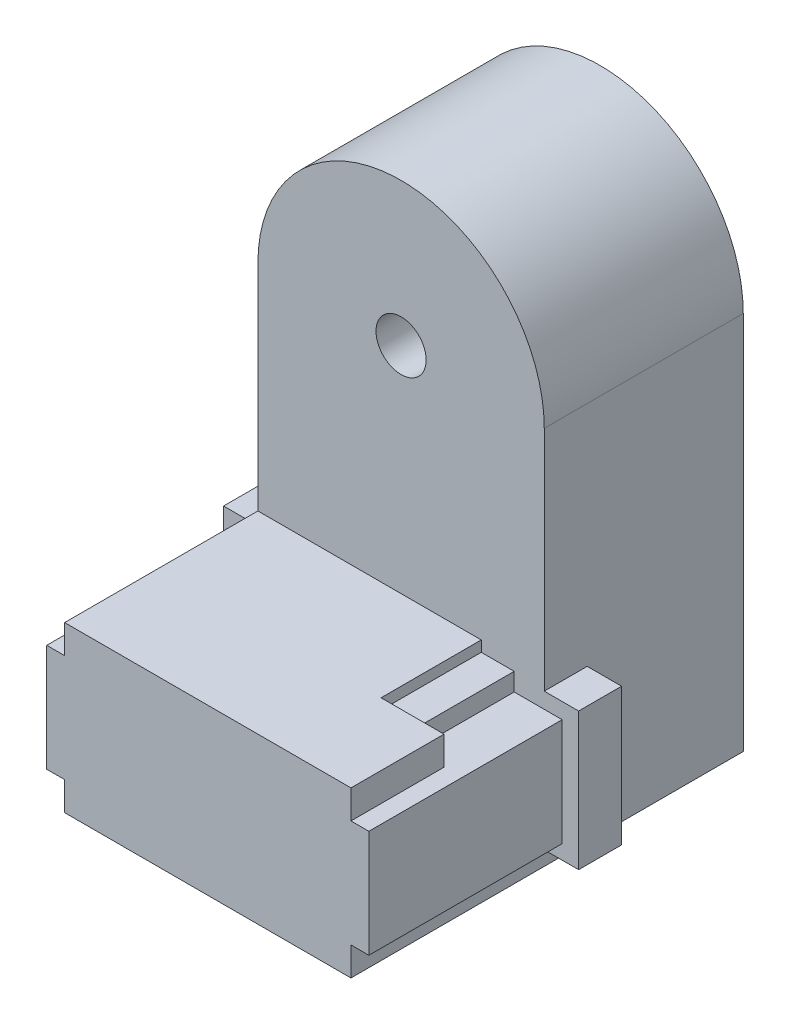
ISO-10303-21;
HEADER;
FILE_DESCRIPTION(('STEP AP214'),'2;1');
FILE_NAME('part.step','',(''),(''),'','','');
FILE_SCHEMA(('AUTOMOTIVE_DESIGN { 1 0 10303 214 1 1 1 1 }'));
ENDSEC;
DATA;
#1=APPLICATION_CONTEXT('core data for automotive mechanical design processes');
#2=APPLICATION_PROTOCOL_DEFINITION('international standard','automotive_design',2000,#1);
#3=PRODUCT_CONTEXT('',#1,'mechanical');
#4=PRODUCT('Part','Part','',(#3));
#5=PRODUCT_RELATED_PRODUCT_CATEGORY('part','',(#4));
#6=PRODUCT_DEFINITION_FORMATION('','',#4);
#7=PRODUCT_DEFINITION_CONTEXT('part definition',#1,'design');
#8=PRODUCT_DEFINITION('design','',#6,#7);
#9=PRODUCT_DEFINITION_SHAPE('','',#8);
#10=(LENGTH_UNIT() NAMED_UNIT(*) SI_UNIT(.MILLI.,.METRE.));
#11=(NAMED_UNIT(*) PLANE_ANGLE_UNIT() SI_UNIT($,.RADIAN.));
#12=(NAMED_UNIT(*) SI_UNIT($,.STERADIAN.) SOLID_ANGLE_UNIT());
#13=UNCERTAINTY_MEASURE_WITH_UNIT(LENGTH_MEASURE(1.E-05),#10,'distance_accuracy_value','');
#14=(GEOMETRIC_REPRESENTATION_CONTEXT(3) GLOBAL_UNCERTAINTY_ASSIGNED_CONTEXT((#13)) GLOBAL_UNIT_ASSIGNED_CONTEXT((#10,
#11,#12)) REPRESENTATION_CONTEXT('',''));
#15=CARTESIAN_POINT('',(0.,0.,0.));
#16=DIRECTION('',(0.,0.,1.));
#17=DIRECTION('',(1.,0.,0.));
#18=AXIS2_PLACEMENT_3D('',#15,#16,#17);
#19=CARTESIAN_POINT('',(20.,0.,13.9));
#20=DIRECTION('',(-1.,0.,0.));
#21=DIRECTION('',(0.,0.,1.));
#22=AXIS2_PLACEMENT_3D('',#19,#20,#21);
#23=PLANE('',#22);
#24=DIRECTION('',(0.,1.,0.));
#25=VECTOR('',#24,1.);
#26=CARTESIAN_POINT('',(20.,11.5,20.9));
#27=LINE('',#26,#25);
#28=CARTESIAN_POINT('',(20.,9.49999999999999,20.9));
#29=VERTEX_POINT('',#28);
#30=CARTESIAN_POINT('',(20.,11.5,20.9));
#31=VERTEX_POINT('',#30);
#32=EDGE_CURVE('E55',#29,#31,#27,.T.);
#33=ORIENTED_EDGE('',*,*,#32,.T.);
#34=DIRECTION('',(0.,0.,-1.));
#35=VECTOR('',#34,1.);
#36=CARTESIAN_POINT('',(20.,11.5,27.4));
#37=LINE('',#36,#35);
#38=CARTESIAN_POINT('',(20.,11.5,27.4));
#39=VERTEX_POINT('',#38);
#40=EDGE_CURVE('E256',#39,#31,#37,.T.);
#41=ORIENTED_EDGE('',*,*,#40,.F.);
#42=DIRECTION('',(0.,1.,0.));
#43=VECTOR('',#42,1.);
#44=CARTESIAN_POINT('',(20.,0.,27.4));
#45=LINE('',#44,#43);
#46=CARTESIAN_POINT('',(20.,9.49999999999999,27.4));
#47=VERTEX_POINT('',#46);
#48=EDGE_CURVE('E409',#47,#39,#45,.T.);
#49=ORIENTED_EDGE('',*,*,#48,.F.);
#50=DIRECTION('',(0.,0.,1.));
#51=VECTOR('',#50,1.);
#52=CARTESIAN_POINT('',(20.,9.49999999999999,-0.00199999999999853));
#53=LINE('',#52,#51);
#54=EDGE_CURVE('E258',#29,#47,#53,.T.);
#55=ORIENTED_EDGE('',*,*,#54,.F.);
#56=EDGE_LOOP('',(#33,#41,#49,#55));
#57=FACE_BOUND('',#56,.T.);
#58=ADVANCED_FACE('F39',(#57),#23,.F.);
#59=CARTESIAN_POINT('',(0.,0.,13.9));
#60=DIRECTION('',(-1.,0.,0.));
#61=DIRECTION('',(0.,0.,1.));
#62=AXIS2_PLACEMENT_3D('',#59,#60,#61);
#63=PLANE('',#62);
#64=DIRECTION('',(0.,0.,-1.));
#65=VECTOR('',#64,1.);
#66=CARTESIAN_POINT('',(0.,0.,13.9));
#67=LINE('',#66,#65);
#68=CARTESIAN_POINT('',(1.6306400674182E-13,-2.41126563160776E-13,13.9));
#69=VERTEX_POINT('',#68);
#70=CARTESIAN_POINT('',(0.,0.,0.));
#71=VERTEX_POINT('',#70);
#72=EDGE_CURVE('E302',#69,#71,#67,.T.);
#73=ORIENTED_EDGE('',*,*,#72,.F.);
#74=DIRECTION('',(0.,-1.,0.));
#75=VECTOR('',#74,1.);
#76=CARTESIAN_POINT('',(1.6306400674182E-13,-2.41126563160776E-13,13.9));
#77=LINE('',#76,#75);
#78=CARTESIAN_POINT('',(1.70169434099423E-13,1.,13.9));
#79=VERTEX_POINT('',#78);
#80=EDGE_CURVE('E595',#79,#69,#77,.T.);
#81=ORIENTED_EDGE('',*,*,#80,.F.);
#82=DIRECTION('',(0.,0.,1.));
#83=VECTOR('',#82,1.);
#84=CARTESIAN_POINT('',(0.,1.,13.9));
#85=LINE('',#84,#83);
#86=CARTESIAN_POINT('',(0.,1.,10.9));
#87=VERTEX_POINT('',#86);
#88=EDGE_CURVE('E317',#87,#79,#85,.T.);
#89=ORIENTED_EDGE('',*,*,#88,.F.);
#90=DIRECTION('',(0.,1.,0.));
#91=VECTOR('',#90,1.);
#92=CARTESIAN_POINT('',(0.,0.,10.9));
#93=LINE('',#92,#91);
#94=CARTESIAN_POINT('',(0.,10.6,10.9));
#95=VERTEX_POINT('',#94);
#96=EDGE_CURVE('E11',#87,#95,#93,.T.);
#97=ORIENTED_EDGE('',*,*,#96,.T.);
#98=DIRECTION('',(0.,0.,-1.));
#99=VECTOR('',#98,1.);
#100=CARTESIAN_POINT('',(0.,10.6,13.9));
#101=LINE('',#100,#99);
#102=CARTESIAN_POINT('',(0.,10.6,13.9));
#103=VERTEX_POINT('',#102);
#104=EDGE_CURVE('E48',#103,#95,#101,.T.);
#105=ORIENTED_EDGE('',*,*,#104,.F.);
#106=DIRECTION('',(0.,1.,0.));
#107=VECTOR('',#106,1.);
#108=CARTESIAN_POINT('',(0.,0.,13.9));
#109=LINE('',#108,#107);
#110=CARTESIAN_POINT('',(0.,9.5,13.9));
#111=VERTEX_POINT('',#110);
#112=EDGE_CURVE('E314',#111,#103,#109,.T.);
#113=ORIENTED_EDGE('',*,*,#112,.F.);
#114=DIRECTION('',(0.,0.,1.));
#115=VECTOR('',#114,1.);
#116=CARTESIAN_POINT('',(0.,9.5,-0.00199999999999853));
#117=LINE('',#116,#115);
#118=CARTESIAN_POINT('',(0.,9.5,27.4));
#119=VERTEX_POINT('',#118);
#120=EDGE_CURVE('E497',#111,#119,#117,.T.);
#121=ORIENTED_EDGE('',*,*,#120,.T.);
#122=DIRECTION('',(0.,-1.,0.));
#123=VECTOR('',#122,1.);
#124=CARTESIAN_POINT('',(0.,0.,27.4));
#125=LINE('',#124,#123);
#126=CARTESIAN_POINT('',(0.,11.5,27.4));
#127=VERTEX_POINT('',#126);
#128=EDGE_CURVE('E400',#127,#119,#125,.T.);
#129=ORIENTED_EDGE('',*,*,#128,.F.);
#130=DIRECTION('',(0.,0.,-1.));
#131=VECTOR('',#130,1.);
#132=CARTESIAN_POINT('',(0.,11.5,27.4));
#133=LINE('',#132,#131);
#134=CARTESIAN_POINT('',(0.,11.5,13.9));
#135=VERTEX_POINT('',#134);
#136=EDGE_CURVE('E267',#127,#135,#133,.T.);
#137=ORIENTED_EDGE('',*,*,#136,.T.);
#138=DIRECTION('',(0.,1.,0.));
#139=VECTOR('',#138,1.);
#140=CARTESIAN_POINT('',(0.,0.,13.9));
#141=LINE('',#140,#139);
#142=CARTESIAN_POINT('',(0.,26.5,13.9));
#143=VERTEX_POINT('',#142);
#144=EDGE_CURVE('E286',#135,#143,#141,.T.);
#145=ORIENTED_EDGE('',*,*,#144,.T.);
#146=DIRECTION('',(0.,0.,-1.));
#147=VECTOR('',#146,1.);
#148=CARTESIAN_POINT('',(0.,26.5,13.9));
#149=LINE('',#148,#147);
#150=CARTESIAN_POINT('',(0.,26.5,0.));
#151=VERTEX_POINT('',#150);
#152=EDGE_CURVE('E307',#143,#151,#149,.T.);
#153=ORIENTED_EDGE('',*,*,#152,.T.);
#154=DIRECTION('',(0.,1.,0.));
#155=VECTOR('',#154,1.);
#156=CARTESIAN_POINT('',(0.,0.,0.));
#157=LINE('',#156,#155);
#158=EDGE_CURVE('E293',#71,#151,#157,.T.);
#159=ORIENTED_EDGE('',*,*,#158,.F.);
#160=EDGE_LOOP('',(#73,#81,#89,#97,#105,#113,#121,#129,#137,#145,#153,#159));
#161=FACE_BOUND('',#160,.T.);
#162=ADVANCED_FACE('F638',(#161),#63,.T.);
#163=CARTESIAN_POINT('',(0.,11.5,27.4));
#164=DIRECTION('',(0.,-1.,0.));
#165=DIRECTION('',(1.,0.,0.));
#166=AXIS2_PLACEMENT_3D('',#163,#164,#165);
#167=PLANE('',#166);
#168=DIRECTION('',(0.,0.,-1.));
#169=VECTOR('',#168,1.);
#170=CARTESIAN_POINT('',(15.6,11.5,20.9));
#171=LINE('',#170,#169);
#172=CARTESIAN_POINT('',(15.6,11.5,20.9));
#173=VERTEX_POINT('',#172);
#174=CARTESIAN_POINT('',(15.6,11.5,13.9));
#175=VERTEX_POINT('',#174);
#176=EDGE_CURVE('E527',#173,#175,#171,.T.);
#177=ORIENTED_EDGE('',*,*,#176,.T.);
#178=DIRECTION('',(-1.,0.,0.));
#179=VECTOR('',#178,1.);
#180=CARTESIAN_POINT('',(0.,11.5,13.9));
#181=LINE('',#180,#179);
#182=EDGE_CURVE('E399',#175,#135,#181,.T.);
#183=ORIENTED_EDGE('',*,*,#182,.T.);
#184=ORIENTED_EDGE('',*,*,#136,.F.);
#185=DIRECTION('',(-1.,0.,0.));
#186=VECTOR('',#185,1.);
#187=CARTESIAN_POINT('',(0.,11.5,27.4));
#188=LINE('',#187,#186);
#189=EDGE_CURVE('E264',#39,#127,#188,.T.);
#190=ORIENTED_EDGE('',*,*,#189,.F.);
#191=ORIENTED_EDGE('',*,*,#40,.T.);
#192=DIRECTION('',(-1.,0.,0.));
#193=VECTOR('',#192,1.);
#194=CARTESIAN_POINT('',(20.,11.5,20.9));
#195=LINE('',#194,#193);
#196=EDGE_CURVE('E243',#31,#173,#195,.T.);
#197=ORIENTED_EDGE('',*,*,#196,.T.);
#198=EDGE_LOOP('',(#177,#183,#184,#190,#191,#197));
#199=FACE_BOUND('',#198,.T.);
#200=ADVANCED_FACE('F262',(#199),#167,.F.);
#201=DIRECTION('',(0.,1.,0.));
#202=VECTOR('',#201,1.);
#203=CARTESIAN_POINT('',(20.,0.,13.9));
#204=LINE('',#203,#202);
#205=CARTESIAN_POINT('',(20.,10.6,13.9));
#206=VERTEX_POINT('',#205);
#207=CARTESIAN_POINT('',(20.,26.5,13.9));
#208=VERTEX_POINT('',#207);
#209=EDGE_CURVE('E278',#206,#208,#204,.T.);
#210=ORIENTED_EDGE('',*,*,#209,.F.);
#211=DIRECTION('',(0.,0.,-1.));
#212=VECTOR('',#211,1.);
#213=CARTESIAN_POINT('',(20.,10.6,13.9));
#214=LINE('',#213,#212);
#215=CARTESIAN_POINT('',(20.,10.6,10.9));
#216=VERTEX_POINT('',#215);
#217=EDGE_CURVE('E395',#206,#216,#214,.T.);
#218=ORIENTED_EDGE('',*,*,#217,.T.);
#219=DIRECTION('',(0.,1.,0.));
#220=VECTOR('',#219,1.);
#221=CARTESIAN_POINT('',(20.,0.,10.9));
#222=LINE('',#221,#220);
#223=CARTESIAN_POINT('',(20.,1.,10.9));
#224=VERTEX_POINT('',#223);
#225=EDGE_CURVE('E388',#224,#216,#222,.T.);
#226=ORIENTED_EDGE('',*,*,#225,.F.);
#227=DIRECTION('',(0.,0.,1.));
#228=VECTOR('',#227,1.);
#229=CARTESIAN_POINT('',(20.,1.,13.9));
#230=LINE('',#229,#228);
#231=CARTESIAN_POINT('',(20.,1.,13.9));
#232=VERTEX_POINT('',#231);
#233=EDGE_CURVE('E391',#224,#232,#230,.T.);
#234=ORIENTED_EDGE('',*,*,#233,.T.);
#235=DIRECTION('',(0.,1.,0.));
#236=VECTOR('',#235,1.);
#237=CARTESIAN_POINT('',(20.,0.,13.9));
#238=LINE('',#237,#236);
#239=CARTESIAN_POINT('',(20.,1.99999999999999,13.9));
#240=VERTEX_POINT('',#239);
#241=EDGE_CURVE('E375',#232,#240,#238,.T.);
#242=ORIENTED_EDGE('',*,*,#241,.T.);
#243=DIRECTION('',(0.,0.,-1.));
#244=VECTOR('',#243,1.);
#245=CARTESIAN_POINT('',(20.,1.99999999999999,-0.00199999999999853));
#246=LINE('',#245,#244);
#247=CARTESIAN_POINT('',(20.,1.99999999999999,27.4));
#248=VERTEX_POINT('',#247);
#249=EDGE_CURVE('E474',#248,#240,#246,.T.);
#250=ORIENTED_EDGE('',*,*,#249,.F.);
#251=CARTESIAN_POINT('',(20.,0.,27.4));
#252=VERTEX_POINT('',#251);
#253=EDGE_CURVE('E410',#252,#248,#45,.T.);
#254=ORIENTED_EDGE('',*,*,#253,.F.);
#255=DIRECTION('',(0.,0.,-1.));
#256=VECTOR('',#255,1.);
#257=CARTESIAN_POINT('',(20.,0.,13.9));
#258=LINE('',#257,#256);
#259=CARTESIAN_POINT('',(20.,0.,0.));
#260=VERTEX_POINT('',#259);
#261=EDGE_CURVE('E288',#252,#260,#258,.T.);
#262=ORIENTED_EDGE('',*,*,#261,.T.);
#263=DIRECTION('',(0.,1.,0.));
#264=VECTOR('',#263,1.);
#265=CARTESIAN_POINT('',(20.,0.,0.));
#266=LINE('',#265,#264);
#267=CARTESIAN_POINT('',(20.,26.5,0.));
#268=VERTEX_POINT('',#267);
#269=EDGE_CURVE('E266',#260,#268,#266,.T.);
#270=ORIENTED_EDGE('',*,*,#269,.T.);
#271=DIRECTION('',(0.,0.,-1.));
#272=VECTOR('',#271,1.);
#273=CARTESIAN_POINT('',(20.,26.5,13.9));
#274=LINE('',#273,#272);
#275=EDGE_CURVE('E310',#208,#268,#274,.T.);
#276=ORIENTED_EDGE('',*,*,#275,.F.);
#277=EDGE_LOOP('',(#210,#218,#226,#234,#242,#250,#254,#262,#270,#276));
#278=FACE_BOUND('',#277,.T.);
#279=ADVANCED_FACE('F41',(#278),#23,.F.);
#280=DIRECTION('',(0.,-1.,0.));
#281=VECTOR('',#280,1.);
#282=CARTESIAN_POINT('',(1.6306400674182E-13,-2.41126563160776E-13,20.9));
#283=LINE('',#282,#281);
#284=CARTESIAN_POINT('',(0.,1.99999999999999,20.9));
#285=VERTEX_POINT('',#284);
#286=CARTESIAN_POINT('',(1.6306400674182E-13,-2.41126563160776E-13,20.9));
#287=VERTEX_POINT('',#286);
#288=EDGE_CURVE('E63',#285,#287,#283,.T.);
#289=ORIENTED_EDGE('',*,*,#288,.T.);
#290=CARTESIAN_POINT('',(0.,0.,27.4));
#291=VERTEX_POINT('',#290);
#292=EDGE_CURVE('E303',#291,#287,#67,.T.);
#293=ORIENTED_EDGE('',*,*,#292,.F.);
#294=CARTESIAN_POINT('',(0.,1.99999999999999,27.4));
#295=VERTEX_POINT('',#294);
#296=EDGE_CURVE('E405',#295,#291,#125,.T.);
#297=ORIENTED_EDGE('',*,*,#296,.F.);
#298=DIRECTION('',(0.,0.,-1.));
#299=VECTOR('',#298,1.);
#300=CARTESIAN_POINT('',(0.,1.99999999999999,-0.00199999999999853));
#301=LINE('',#300,#299);
#302=EDGE_CURVE('E503',#295,#285,#301,.T.);
#303=ORIENTED_EDGE('',*,*,#302,.T.);
#304=EDGE_LOOP('',(#289,#293,#297,#303));
#305=FACE_BOUND('',#304,.T.);
#306=ADVANCED_FACE('F431',(#305),#63,.T.);
#307=CARTESIAN_POINT('',(10.,26.5,13.9));
#308=DIRECTION('',(0.,0.,-1.));
#309=DIRECTION('',(-1.,0.,0.));
#310=AXIS2_PLACEMENT_3D('',#307,#308,#309);
#311=CYLINDRICAL_SURFACE('',#310,10.);
#312=CARTESIAN_POINT('',(10.,26.5,0.));
#313=DIRECTION('',(0.,0.,1.));
#314=DIRECTION('',(1.,0.,0.));
#315=AXIS2_PLACEMENT_3D('',#312,#313,#314);
#316=CIRCLE('',#315,10.);
#317=EDGE_CURVE('E272',#268,#151,#316,.T.);
#318=ORIENTED_EDGE('',*,*,#317,.T.);
#319=ORIENTED_EDGE('',*,*,#152,.F.);
#320=CARTESIAN_POINT('',(10.,26.5,13.9));
#321=DIRECTION('',(0.,0.,1.));
#322=DIRECTION('',(1.,0.,0.));
#323=AXIS2_PLACEMENT_3D('',#320,#321,#322);
#324=CIRCLE('',#323,10.);
#325=EDGE_CURVE('E281',#208,#143,#324,.T.);
#326=ORIENTED_EDGE('',*,*,#325,.F.);
#327=ORIENTED_EDGE('',*,*,#275,.T.);
#328=EDGE_LOOP('',(#318,#319,#326,#327));
#329=FACE_BOUND('',#328,.T.);
#330=ADVANCED_FACE('F445',(#329),#311,.T.);
#331=CARTESIAN_POINT('',(0.,0.,13.9));
#332=DIRECTION('',(0.,1.,0.));
#333=DIRECTION('',(0.,0.,1.));
#334=AXIS2_PLACEMENT_3D('',#331,#332,#333);
#335=PLANE('',#334);
#336=ORIENTED_EDGE('',*,*,#292,.T.);
#337=DIRECTION('',(1.,0.,0.));
#338=VECTOR('',#337,1.);
#339=CARTESIAN_POINT('',(1.6306400674182E-13,-2.41126563160776E-13,20.9));
#340=LINE('',#339,#338);
#341=CARTESIAN_POINT('',(4.40000000000016,-2.70655720058244E-13,20.9));
#342=VERTEX_POINT('',#341);
#343=EDGE_CURVE('E592',#287,#342,#340,.T.);
#344=ORIENTED_EDGE('',*,*,#343,.T.);
#345=DIRECTION('',(0.,0.,-1.));
#346=VECTOR('',#345,1.);
#347=CARTESIAN_POINT('',(4.40000000000016,-2.70655720058244E-13,20.9));
#348=LINE('',#347,#346);
#349=CARTESIAN_POINT('',(4.40000000000016,-2.70655720058244E-13,13.9));
#350=VERTEX_POINT('',#349);
#351=EDGE_CURVE('E562',#342,#350,#348,.T.);
#352=ORIENTED_EDGE('',*,*,#351,.T.);
#353=DIRECTION('',(1.,0.,0.));
#354=VECTOR('',#353,1.);
#355=CARTESIAN_POINT('',(1.6306400674182E-13,-2.41126563160776E-13,13.9));
#356=LINE('',#355,#354);
#357=EDGE_CURVE('E608',#69,#350,#356,.T.);
#358=ORIENTED_EDGE('',*,*,#357,.F.);
#359=ORIENTED_EDGE('',*,*,#72,.T.);
#360=DIRECTION('',(1.,0.,0.));
#361=VECTOR('',#360,1.);
#362=CARTESIAN_POINT('',(0.,0.,0.));
#363=LINE('',#362,#361);
#364=EDGE_CURVE('E282',#71,#260,#363,.T.);
#365=ORIENTED_EDGE('',*,*,#364,.T.);
#366=ORIENTED_EDGE('',*,*,#261,.F.);
#367=DIRECTION('',(1.,0.,0.));
#368=VECTOR('',#367,1.);
#369=CARTESIAN_POINT('',(0.,0.,27.4));
#370=LINE('',#369,#368);
#371=EDGE_CURVE('E404',#291,#252,#370,.T.);
#372=ORIENTED_EDGE('',*,*,#371,.F.);
#373=EDGE_LOOP('',(#336,#344,#352,#358,#359,#365,#366,#372));
#374=FACE_BOUND('',#373,.T.);
#375=ADVANCED_FACE('F434',(#374),#335,.F.);
#376=CARTESIAN_POINT('',(10.,26.5,13.9));
#377=DIRECTION('',(0.,0.,1.));
#378=DIRECTION('',(1.,0.,0.));
#379=AXIS2_PLACEMENT_3D('',#376,#377,#378);
#380=PLANE('',#379);
#381=CARTESIAN_POINT('',(10.,26.5,13.9));
#382=DIRECTION('',(0.,0.,1.));
#383=DIRECTION('',(1.,0.,0.));
#384=AXIS2_PLACEMENT_3D('',#381,#382,#383);
#385=CIRCLE('',#384,1.75);
#386=CARTESIAN_POINT('',(11.75,26.5,13.9));
#387=VERTEX_POINT('',#386);
#388=EDGE_CURVE('E612',#387,#387,#385,.F.);
#389=ORIENTED_EDGE('',*,*,#388,.T.);
#390=EDGE_LOOP('',(#389));
#391=FACE_BOUND('',#390,.T.);
#392=ORIENTED_EDGE('',*,*,#182,.F.);
#393=DIRECTION('',(0.,-1.,0.));
#394=VECTOR('',#393,1.);
#395=CARTESIAN_POINT('',(15.6,11.5,13.9));
#396=LINE('',#395,#394);
#397=CARTESIAN_POINT('',(15.6,10.75,13.9));
#398=VERTEX_POINT('',#397);
#399=EDGE_CURVE('E559',#175,#398,#396,.T.);
#400=ORIENTED_EDGE('',*,*,#399,.T.);
#401=DIRECTION('',(1.,0.,0.));
#402=VECTOR('',#401,1.);
#403=CARTESIAN_POINT('',(15.6,10.75,13.9));
#404=LINE('',#403,#402);
#405=CARTESIAN_POINT('',(17.9,10.75,13.9));
#406=VERTEX_POINT('',#405);
#407=EDGE_CURVE('E556',#398,#406,#404,.T.);
#408=ORIENTED_EDGE('',*,*,#407,.T.);
#409=DIRECTION('',(0.,-1.,0.));
#410=VECTOR('',#409,1.);
#411=CARTESIAN_POINT('',(17.9,9.49999999999999,13.9));
#412=LINE('',#411,#410);
#413=CARTESIAN_POINT('',(17.9,9.49999999999999,13.9));
#414=VERTEX_POINT('',#413);
#415=EDGE_CURVE('E260',#406,#414,#412,.T.);
#416=ORIENTED_EDGE('',*,*,#415,.T.);
#417=DIRECTION('',(1.,0.,0.));
#418=VECTOR('',#417,1.);
#419=CARTESIAN_POINT('',(-1.25,9.5,13.9));
#420=LINE('',#419,#418);
#421=CARTESIAN_POINT('',(21.25,9.49999999999999,13.9));
#422=VERTEX_POINT('',#421);
#423=EDGE_CURVE('E359',#414,#422,#420,.T.);
#424=ORIENTED_EDGE('',*,*,#423,.T.);
#425=DIRECTION('',(0.,-1.,0.));
#426=VECTOR('',#425,1.);
#427=CARTESIAN_POINT('',(21.25,1.99999999999999,13.9));
#428=LINE('',#427,#426);
#429=CARTESIAN_POINT('',(21.25,1.99999999999999,13.9));
#430=VERTEX_POINT('',#429);
#431=EDGE_CURVE('E468',#422,#430,#428,.T.);
#432=ORIENTED_EDGE('',*,*,#431,.T.);
#433=DIRECTION('',(-1.,0.,0.));
#434=VECTOR('',#433,1.);
#435=CARTESIAN_POINT('',(-1.25,1.99999999999999,13.9));
#436=LINE('',#435,#434);
#437=EDGE_CURVE('E471',#430,#240,#436,.T.);
#438=ORIENTED_EDGE('',*,*,#437,.T.);
#439=ORIENTED_EDGE('',*,*,#241,.F.);
#440=DIRECTION('',(1.,0.,0.));
#441=VECTOR('',#440,1.);
#442=CARTESIAN_POINT('',(-2.4,1.,13.9));
#443=LINE('',#442,#441);
#444=CARTESIAN_POINT('',(22.4,1.,13.9));
#445=VERTEX_POINT('',#444);
#446=EDGE_CURVE('E358',#232,#445,#443,.T.);
#447=ORIENTED_EDGE('',*,*,#446,.T.);
#448=DIRECTION('',(0.,1.,0.));
#449=VECTOR('',#448,1.);
#450=CARTESIAN_POINT('',(22.4,10.6,13.9));
#451=LINE('',#450,#449);
#452=CARTESIAN_POINT('',(22.4,10.6,13.9));
#453=VERTEX_POINT('',#452);
#454=EDGE_CURVE('E364',#445,#453,#451,.T.);
#455=ORIENTED_EDGE('',*,*,#454,.T.);
#456=DIRECTION('',(-1.,0.,0.));
#457=VECTOR('',#456,1.);
#458=CARTESIAN_POINT('',(-2.40000000000001,10.6,13.9));
#459=LINE('',#458,#457);
#460=EDGE_CURVE('E368',#453,#206,#459,.T.);
#461=ORIENTED_EDGE('',*,*,#460,.T.);
#462=ORIENTED_EDGE('',*,*,#209,.T.);
#463=ORIENTED_EDGE('',*,*,#325,.T.);
#464=ORIENTED_EDGE('',*,*,#144,.F.);
#465=EDGE_LOOP('',(#392,#400,#408,#416,#424,#432,#438,#439,#447,#455,#461,#462,#463,#464));
#466=FACE_BOUND('',#465,.T.);
#467=ADVANCED_FACE('F450',(#391,#466),#380,.T.);
#468=CARTESIAN_POINT('',(10.,26.5,0.));
#469=DIRECTION('',(0.,0.,1.));
#470=DIRECTION('',(1.,0.,0.));
#471=AXIS2_PLACEMENT_3D('',#468,#469,#470);
#472=PLANE('',#471);
#473=CARTESIAN_POINT('',(10.,26.5,0.));
#474=DIRECTION('',(0.,0.,-1.));
#475=DIRECTION('',(-1.,0.,0.));
#476=AXIS2_PLACEMENT_3D('',#473,#474,#475);
#477=CIRCLE('',#476,1.75);
#478=CARTESIAN_POINT('',(8.25,26.5,0.));
#479=VERTEX_POINT('',#478);
#480=EDGE_CURVE('E616',#479,#479,#477,.T.);
#481=ORIENTED_EDGE('',*,*,#480,.F.);
#482=EDGE_LOOP('',(#481));
#483=FACE_BOUND('',#482,.T.);
#484=ORIENTED_EDGE('',*,*,#269,.F.);
#485=ORIENTED_EDGE('',*,*,#364,.F.);
#486=ORIENTED_EDGE('',*,*,#158,.T.);
#487=ORIENTED_EDGE('',*,*,#317,.F.);
#488=EDGE_LOOP('',(#484,#485,#486,#487));
#489=FACE_BOUND('',#488,.T.);
#490=ADVANCED_FACE('F440',(#483,#489),#472,.F.);
#491=CARTESIAN_POINT('',(0.,0.,27.4));
#492=DIRECTION('',(0.,0.,-1.));
#493=DIRECTION('',(-1.,0.,0.));
#494=AXIS2_PLACEMENT_3D('',#491,#492,#493);
#495=PLANE('',#494);
#496=ORIENTED_EDGE('',*,*,#128,.T.);
#497=DIRECTION('',(-1.,0.,0.));
#498=VECTOR('',#497,1.);
#499=CARTESIAN_POINT('',(-1.25,9.5,27.4));
#500=LINE('',#499,#498);
#501=CARTESIAN_POINT('',(-1.25,9.5,27.4));
#502=VERTEX_POINT('',#501);
#503=EDGE_CURVE('E520',#119,#502,#500,.T.);
#504=ORIENTED_EDGE('',*,*,#503,.T.);
#505=DIRECTION('',(0.,-1.,0.));
#506=VECTOR('',#505,1.);
#507=CARTESIAN_POINT('',(-1.25,1.99999999999999,27.4));
#508=LINE('',#507,#506);
#509=CARTESIAN_POINT('',(-1.25,1.99999999999999,27.4));
#510=VERTEX_POINT('',#509);
#511=EDGE_CURVE('E524',#502,#510,#508,.T.);
#512=ORIENTED_EDGE('',*,*,#511,.T.);
#513=DIRECTION('',(1.,0.,0.));
#514=VECTOR('',#513,1.);
#515=CARTESIAN_POINT('',(-1.25,1.99999999999999,27.4));
#516=LINE('',#515,#514);
#517=EDGE_CURVE('E427',#510,#295,#516,.T.);
#518=ORIENTED_EDGE('',*,*,#517,.T.);
#519=ORIENTED_EDGE('',*,*,#296,.T.);
#520=ORIENTED_EDGE('',*,*,#371,.T.);
#521=ORIENTED_EDGE('',*,*,#253,.T.);
#522=DIRECTION('',(1.,0.,0.));
#523=VECTOR('',#522,1.);
#524=CARTESIAN_POINT('',(-1.25,1.99999999999999,27.4));
#525=LINE('',#524,#523);
#526=CARTESIAN_POINT('',(21.25,1.99999999999999,27.4));
#527=VERTEX_POINT('',#526);
#528=EDGE_CURVE('E485',#248,#527,#525,.T.);
#529=ORIENTED_EDGE('',*,*,#528,.T.);
#530=DIRECTION('',(0.,1.,0.));
#531=VECTOR('',#530,1.);
#532=CARTESIAN_POINT('',(21.25,1.99999999999999,27.4));
#533=LINE('',#532,#531);
#534=CARTESIAN_POINT('',(21.25,9.49999999999999,27.4));
#535=VERTEX_POINT('',#534);
#536=EDGE_CURVE('E489',#527,#535,#533,.T.);
#537=ORIENTED_EDGE('',*,*,#536,.T.);
#538=DIRECTION('',(-1.,0.,0.));
#539=VECTOR('',#538,1.);
#540=CARTESIAN_POINT('',(-1.25,9.5,27.4));
#541=LINE('',#540,#539);
#542=EDGE_CURVE('E493',#535,#47,#541,.T.);
#543=ORIENTED_EDGE('',*,*,#542,.T.);
#544=ORIENTED_EDGE('',*,*,#48,.T.);
#545=ORIENTED_EDGE('',*,*,#189,.T.);
#546=EDGE_LOOP('',(#496,#504,#512,#518,#519,#520,#521,#529,#537,#543,#544,#545));
#547=FACE_BOUND('',#546,.T.);
#548=ADVANCED_FACE('F422',(#547),#495,.F.);
#549=CARTESIAN_POINT('',(-2.40000000000001,10.6,10.9));
#550=DIRECTION('',(-1.,0.,0.));
#551=DIRECTION('',(0.,-1.,0.));
#552=AXIS2_PLACEMENT_3D('',#549,#550,#551);
#553=PLANE('',#552);
#554=DIRECTION('',(0.,-1.,0.));
#555=VECTOR('',#554,1.);
#556=CARTESIAN_POINT('',(-2.40000000000001,10.6,13.9));
#557=LINE('',#556,#555);
#558=CARTESIAN_POINT('',(-2.40000000000001,10.6,13.9));
#559=VERTEX_POINT('',#558);
#560=CARTESIAN_POINT('',(-2.4,1.,13.9));
#561=VERTEX_POINT('',#560);
#562=EDGE_CURVE('E354',#559,#561,#557,.T.);
#563=ORIENTED_EDGE('',*,*,#562,.F.);
#564=DIRECTION('',(0.,0.,1.));
#565=VECTOR('',#564,1.);
#566=CARTESIAN_POINT('',(-2.40000000000001,10.6,10.9));
#567=LINE('',#566,#565);
#568=CARTESIAN_POINT('',(-2.40000000000001,10.6,10.9));
#569=VERTEX_POINT('',#568);
#570=EDGE_CURVE('E372',#569,#559,#567,.T.);
#571=ORIENTED_EDGE('',*,*,#570,.F.);
#572=DIRECTION('',(0.,-1.,0.));
#573=VECTOR('',#572,1.);
#574=CARTESIAN_POINT('',(-2.40000000000001,10.6,10.9));
#575=LINE('',#574,#573);
#576=CARTESIAN_POINT('',(-2.4,1.,10.9));
#577=VERTEX_POINT('',#576);
#578=EDGE_CURVE('E340',#569,#577,#575,.T.);
#579=ORIENTED_EDGE('',*,*,#578,.T.);
#580=DIRECTION('',(0.,0.,1.));
#581=VECTOR('',#580,1.);
#582=CARTESIAN_POINT('',(-2.4,1.,10.9));
#583=LINE('',#582,#581);
#584=EDGE_CURVE('E348',#577,#561,#583,.T.);
#585=ORIENTED_EDGE('',*,*,#584,.T.);
#586=EDGE_LOOP('',(#563,#571,#579,#585));
#587=FACE_BOUND('',#586,.T.);
#588=ADVANCED_FACE('F632',(#587),#553,.T.);
#589=CARTESIAN_POINT('',(0.,0.,13.9));
#590=DIRECTION('',(0.,0.,1.));
#591=DIRECTION('',(1.,0.,0.));
#592=AXIS2_PLACEMENT_3D('',#589,#590,#591);
#593=PLANE('',#592);
#594=DIRECTION('',(-1.,0.,0.));
#595=VECTOR('',#594,1.);
#596=CARTESIAN_POINT('',(-1.25,1.99999999999999,13.9));
#597=LINE('',#596,#595);
#598=CARTESIAN_POINT('',(2.10000000000018,1.99999999999975,13.9));
#599=VERTEX_POINT('',#598);
#600=CARTESIAN_POINT('',(-1.25,1.99999999999999,13.9));
#601=VERTEX_POINT('',#600);
#602=EDGE_CURVE('E506',#599,#601,#597,.T.);
#603=ORIENTED_EDGE('',*,*,#602,.T.);
#604=DIRECTION('',(0.,1.,0.));
#605=VECTOR('',#604,1.);
#606=CARTESIAN_POINT('',(-1.25,1.99999999999999,13.9));
#607=LINE('',#606,#605);
#608=CARTESIAN_POINT('',(-1.25,9.5,13.9));
#609=VERTEX_POINT('',#608);
#610=EDGE_CURVE('E509',#601,#609,#607,.T.);
#611=ORIENTED_EDGE('',*,*,#610,.T.);
#612=DIRECTION('',(1.,0.,0.));
#613=VECTOR('',#612,1.);
#614=CARTESIAN_POINT('',(-1.25,9.5,13.9));
#615=LINE('',#614,#613);
#616=EDGE_CURVE('E500',#609,#111,#615,.T.);
#617=ORIENTED_EDGE('',*,*,#616,.T.);
#618=ORIENTED_EDGE('',*,*,#112,.T.);
#619=EDGE_CURVE('E330',#103,#559,#459,.T.);
#620=ORIENTED_EDGE('',*,*,#619,.T.);
#621=ORIENTED_EDGE('',*,*,#562,.T.);
#622=EDGE_CURVE('E360',#561,#79,#443,.T.);
#623=ORIENTED_EDGE('',*,*,#622,.T.);
#624=ORIENTED_EDGE('',*,*,#80,.T.);
#625=ORIENTED_EDGE('',*,*,#357,.T.);
#626=DIRECTION('',(0.,1.,0.));
#627=VECTOR('',#626,1.);
#628=CARTESIAN_POINT('',(4.40000000000016,-2.70655720058244E-13,13.9));
#629=LINE('',#628,#627);
#630=CARTESIAN_POINT('',(4.40000000000017,0.749999999999728,13.9));
#631=VERTEX_POINT('',#630);
#632=EDGE_CURVE('E605',#350,#631,#629,.T.);
#633=ORIENTED_EDGE('',*,*,#632,.T.);
#634=DIRECTION('',(-1.,0.,0.));
#635=VECTOR('',#634,1.);
#636=CARTESIAN_POINT('',(4.40000000000017,0.749999999999728,13.9));
#637=LINE('',#636,#635);
#638=CARTESIAN_POINT('',(2.10000000000017,0.749999999999744,13.9));
#639=VERTEX_POINT('',#638);
#640=EDGE_CURVE('E602',#631,#639,#637,.T.);
#641=ORIENTED_EDGE('',*,*,#640,.T.);
#642=DIRECTION('',(0.,1.,0.));
#643=VECTOR('',#642,1.);
#644=CARTESIAN_POINT('',(2.10000000000018,1.99999999999975,13.9));
#645=LINE('',#644,#643);
#646=EDGE_CURVE('E598',#639,#599,#645,.T.);
#647=ORIENTED_EDGE('',*,*,#646,.T.);
#648=EDGE_LOOP('',(#603,#611,#617,#618,#620,#621,#623,#624,#625,#633,#641,#647));
#649=FACE_BOUND('',#648,.T.);
#650=ADVANCED_FACE('F629',(#649),#593,.T.);
#651=CARTESIAN_POINT('',(0.,0.,10.9));
#652=DIRECTION('',(0.,0.,1.));
#653=DIRECTION('',(1.,0.,0.));
#654=AXIS2_PLACEMENT_3D('',#651,#652,#653);
#655=PLANE('',#654);
#656=ORIENTED_EDGE('',*,*,#96,.F.);
#657=DIRECTION('',(1.,0.,0.));
#658=VECTOR('',#657,1.);
#659=CARTESIAN_POINT('',(-2.4,1.,10.9));
#660=LINE('',#659,#658);
#661=EDGE_CURVE('E350',#577,#87,#660,.T.);
#662=ORIENTED_EDGE('',*,*,#661,.F.);
#663=ORIENTED_EDGE('',*,*,#578,.F.);
#664=DIRECTION('',(-1.,0.,0.));
#665=VECTOR('',#664,1.);
#666=CARTESIAN_POINT('',(-2.40000000000001,10.6,10.9));
#667=LINE('',#666,#665);
#668=EDGE_CURVE('E328',#95,#569,#667,.T.);
#669=ORIENTED_EDGE('',*,*,#668,.F.);
#670=EDGE_LOOP('',(#656,#662,#663,#669));
#671=FACE_BOUND('',#670,.T.);
#672=ADVANCED_FACE('F336',(#671),#655,.F.);
#673=CARTESIAN_POINT('',(-2.4,1.,10.9));
#674=DIRECTION('',(0.,-1.,0.));
#675=DIRECTION('',(0.,0.,-1.));
#676=AXIS2_PLACEMENT_3D('',#673,#674,#675);
#677=PLANE('',#676);
#678=ORIENTED_EDGE('',*,*,#661,.T.);
#679=ORIENTED_EDGE('',*,*,#88,.T.);
#680=ORIENTED_EDGE('',*,*,#622,.F.);
#681=ORIENTED_EDGE('',*,*,#584,.F.);
#682=EDGE_LOOP('',(#678,#679,#680,#681));
#683=FACE_BOUND('',#682,.T.);
#684=ADVANCED_FACE('F634',(#683),#677,.T.);
#685=CARTESIAN_POINT('',(-2.40000000000001,10.6,10.9));
#686=DIRECTION('',(0.,1.,0.));
#687=DIRECTION('',(0.,0.,1.));
#688=AXIS2_PLACEMENT_3D('',#685,#686,#687);
#689=PLANE('',#688);
#690=ORIENTED_EDGE('',*,*,#619,.F.);
#691=ORIENTED_EDGE('',*,*,#104,.T.);
#692=ORIENTED_EDGE('',*,*,#668,.T.);
#693=ORIENTED_EDGE('',*,*,#570,.T.);
#694=EDGE_LOOP('',(#690,#691,#692,#693));
#695=FACE_BOUND('',#694,.T.);
#696=ADVANCED_FACE('F326',(#695),#689,.T.);
#697=ORIENTED_EDGE('',*,*,#217,.F.);
#698=ORIENTED_EDGE('',*,*,#460,.F.);
#699=DIRECTION('',(0.,0.,1.));
#700=VECTOR('',#699,1.);
#701=CARTESIAN_POINT('',(22.4,10.6,10.9));
#702=LINE('',#701,#700);
#703=CARTESIAN_POINT('',(22.4,10.6,10.9));
#704=VERTEX_POINT('',#703);
#705=EDGE_CURVE('E376',#704,#453,#702,.T.);
#706=ORIENTED_EDGE('',*,*,#705,.F.);
#707=EDGE_CURVE('E342',#704,#216,#667,.T.);
#708=ORIENTED_EDGE('',*,*,#707,.T.);
#709=EDGE_LOOP('',(#697,#698,#706,#708));
#710=FACE_BOUND('',#709,.T.);
#711=ADVANCED_FACE('F453',(#710),#689,.T.);
#712=ORIENTED_EDGE('',*,*,#233,.F.);
#713=CARTESIAN_POINT('',(22.4,1.,10.9));
#714=VERTEX_POINT('',#713);
#715=EDGE_CURVE('E459',#224,#714,#660,.T.);
#716=ORIENTED_EDGE('',*,*,#715,.T.);
#717=DIRECTION('',(0.,0.,1.));
#718=VECTOR('',#717,1.);
#719=CARTESIAN_POINT('',(22.4,1.,10.9));
#720=LINE('',#719,#718);
#721=EDGE_CURVE('E379',#714,#445,#720,.T.);
#722=ORIENTED_EDGE('',*,*,#721,.T.);
#723=ORIENTED_EDGE('',*,*,#446,.F.);
#724=EDGE_LOOP('',(#712,#716,#722,#723));
#725=FACE_BOUND('',#724,.T.);
#726=ADVANCED_FACE('F463',(#725),#677,.T.);
#727=ORIENTED_EDGE('',*,*,#715,.F.);
#728=ORIENTED_EDGE('',*,*,#225,.T.);
#729=ORIENTED_EDGE('',*,*,#707,.F.);
#730=DIRECTION('',(0.,1.,0.));
#731=VECTOR('',#730,1.);
#732=CARTESIAN_POINT('',(22.4,10.6,10.9));
#733=LINE('',#732,#731);
#734=EDGE_CURVE('E343',#714,#704,#733,.T.);
#735=ORIENTED_EDGE('',*,*,#734,.F.);
#736=EDGE_LOOP('',(#727,#728,#729,#735));
#737=FACE_BOUND('',#736,.T.);
#738=ADVANCED_FACE('F458',(#737),#655,.F.);
#739=CARTESIAN_POINT('',(22.4,10.6,10.9));
#740=DIRECTION('',(1.,0.,0.));
#741=DIRECTION('',(0.,1.,0.));
#742=AXIS2_PLACEMENT_3D('',#739,#740,#741);
#743=PLANE('',#742);
#744=ORIENTED_EDGE('',*,*,#454,.F.);
#745=ORIENTED_EDGE('',*,*,#721,.F.);
#746=ORIENTED_EDGE('',*,*,#734,.T.);
#747=ORIENTED_EDGE('',*,*,#705,.T.);
#748=EDGE_LOOP('',(#744,#745,#746,#747));
#749=FACE_BOUND('',#748,.T.);
#750=ADVANCED_FACE('F669',(#749),#743,.T.);
#751=CARTESIAN_POINT('',(-1.25,9.5,-0.00199999999999853));
#752=DIRECTION('',(0.,1.,0.));
#753=DIRECTION('',(-1.,0.,0.));
#754=AXIS2_PLACEMENT_3D('',#751,#752,#753);
#755=PLANE('',#754);
#756=ORIENTED_EDGE('',*,*,#423,.F.);
#757=DIRECTION('',(0.,0.,-1.));
#758=VECTOR('',#757,1.);
#759=CARTESIAN_POINT('',(17.9,9.49999999999999,20.9));
#760=LINE('',#759,#758);
#761=CARTESIAN_POINT('',(17.9,9.49999999999999,20.9));
#762=VERTEX_POINT('',#761);
#763=EDGE_CURVE('E538',#762,#414,#760,.T.);
#764=ORIENTED_EDGE('',*,*,#763,.F.);
#765=DIRECTION('',(1.,0.,0.));
#766=VECTOR('',#765,1.);
#767=CARTESIAN_POINT('',(20.,9.49999999999999,20.9));
#768=LINE('',#767,#766);
#769=EDGE_CURVE('E542',#762,#29,#768,.T.);
#770=ORIENTED_EDGE('',*,*,#769,.T.);
#771=ORIENTED_EDGE('',*,*,#54,.T.);
#772=ORIENTED_EDGE('',*,*,#542,.F.);
#773=DIRECTION('',(0.,0.,1.));
#774=VECTOR('',#773,1.);
#775=CARTESIAN_POINT('',(21.25,9.49999999999999,-0.00199999999999853));
#776=LINE('',#775,#774);
#777=EDGE_CURVE('E482',#422,#535,#776,.T.);
#778=ORIENTED_EDGE('',*,*,#777,.F.);
#779=EDGE_LOOP('',(#756,#764,#770,#771,#772,#778));
#780=FACE_BOUND('',#779,.T.);
#781=ADVANCED_FACE('F662',(#780),#755,.T.);
#782=CARTESIAN_POINT('',(21.25,1.99999999999999,-0.00199999999999853));
#783=DIRECTION('',(1.,0.,0.));
#784=DIRECTION('',(0.,1.,0.));
#785=AXIS2_PLACEMENT_3D('',#782,#783,#784);
#786=PLANE('',#785);
#787=ORIENTED_EDGE('',*,*,#431,.F.);
#788=ORIENTED_EDGE('',*,*,#777,.T.);
#789=ORIENTED_EDGE('',*,*,#536,.F.);
#790=DIRECTION('',(0.,0.,1.));
#791=VECTOR('',#790,1.);
#792=CARTESIAN_POINT('',(21.25,1.99999999999999,-0.00199999999999853));
#793=LINE('',#792,#791);
#794=EDGE_CURVE('E479',#430,#527,#793,.T.);
#795=ORIENTED_EDGE('',*,*,#794,.F.);
#796=EDGE_LOOP('',(#787,#788,#789,#795));
#797=FACE_BOUND('',#796,.T.);
#798=ADVANCED_FACE('F659',(#797),#786,.T.);
#799=CARTESIAN_POINT('',(-1.25,1.99999999999999,-0.00199999999999853));
#800=DIRECTION('',(0.,-1.,0.));
#801=DIRECTION('',(1.,0.,0.));
#802=AXIS2_PLACEMENT_3D('',#799,#800,#801);
#803=PLANE('',#802);
#804=ORIENTED_EDGE('',*,*,#437,.F.);
#805=ORIENTED_EDGE('',*,*,#794,.T.);
#806=ORIENTED_EDGE('',*,*,#528,.F.);
#807=ORIENTED_EDGE('',*,*,#249,.T.);
#808=EDGE_LOOP('',(#804,#805,#806,#807));
#809=FACE_BOUND('',#808,.T.);
#810=ADVANCED_FACE('F665',(#809),#803,.T.);
#811=CARTESIAN_POINT('',(-1.25,1.99999999999999,-0.00199999999999853));
#812=DIRECTION('',(0.,-1.,0.));
#813=DIRECTION('',(1.,0.,0.));
#814=AXIS2_PLACEMENT_3D('',#811,#812,#813);
#815=PLANE('',#814);
#816=ORIENTED_EDGE('',*,*,#602,.F.);
#817=DIRECTION('',(0.,0.,-1.));
#818=VECTOR('',#817,1.);
#819=CARTESIAN_POINT('',(2.10000000000018,1.99999999999975,20.9));
#820=LINE('',#819,#818);
#821=CARTESIAN_POINT('',(2.10000000000018,1.99999999999975,20.9));
#822=VERTEX_POINT('',#821);
#823=EDGE_CURVE('E574',#822,#599,#820,.T.);
#824=ORIENTED_EDGE('',*,*,#823,.F.);
#825=DIRECTION('',(-1.,0.,0.));
#826=VECTOR('',#825,1.);
#827=CARTESIAN_POINT('',(1.77274861457022E-13,1.99999999999977,20.9));
#828=LINE('',#827,#826);
#829=EDGE_CURVE('E580',#822,#285,#828,.T.);
#830=ORIENTED_EDGE('',*,*,#829,.T.);
#831=ORIENTED_EDGE('',*,*,#302,.F.);
#832=ORIENTED_EDGE('',*,*,#517,.F.);
#833=DIRECTION('',(0.,0.,1.));
#834=VECTOR('',#833,1.);
#835=CARTESIAN_POINT('',(-1.25,1.99999999999999,-0.00199999999999853));
#836=LINE('',#835,#834);
#837=EDGE_CURVE('E512',#601,#510,#836,.T.);
#838=ORIENTED_EDGE('',*,*,#837,.F.);
#839=EDGE_LOOP('',(#816,#824,#830,#831,#832,#838));
#840=FACE_BOUND('',#839,.T.);
#841=ADVANCED_FACE('F667',(#840),#815,.T.);
#842=CARTESIAN_POINT('',(-1.25,1.99999999999999,-0.00199999999999853));
#843=DIRECTION('',(-1.,0.,0.));
#844=DIRECTION('',(0.,-1.,0.));
#845=AXIS2_PLACEMENT_3D('',#842,#843,#844);
#846=PLANE('',#845);
#847=ORIENTED_EDGE('',*,*,#610,.F.);
#848=ORIENTED_EDGE('',*,*,#837,.T.);
#849=ORIENTED_EDGE('',*,*,#511,.F.);
#850=DIRECTION('',(0.,0.,1.));
#851=VECTOR('',#850,1.);
#852=CARTESIAN_POINT('',(-1.25,9.5,-0.00199999999999853));
#853=LINE('',#852,#851);
#854=EDGE_CURVE('E515',#609,#502,#853,.T.);
#855=ORIENTED_EDGE('',*,*,#854,.F.);
#856=EDGE_LOOP('',(#847,#848,#849,#855));
#857=FACE_BOUND('',#856,.T.);
#858=ADVANCED_FACE('F674',(#857),#846,.T.);
#859=CARTESIAN_POINT('',(-1.25,9.5,-0.00199999999999853));
#860=DIRECTION('',(0.,1.,0.));
#861=DIRECTION('',(-1.,0.,0.));
#862=AXIS2_PLACEMENT_3D('',#859,#860,#861);
#863=PLANE('',#862);
#864=ORIENTED_EDGE('',*,*,#616,.F.);
#865=ORIENTED_EDGE('',*,*,#854,.T.);
#866=ORIENTED_EDGE('',*,*,#503,.F.);
#867=ORIENTED_EDGE('',*,*,#120,.F.);
#868=EDGE_LOOP('',(#864,#865,#866,#867));
#869=FACE_BOUND('',#868,.T.);
#870=ADVANCED_FACE('F785',(#869),#863,.T.);
#871=CARTESIAN_POINT('',(4.40000000000016,-2.70655720058244E-13,20.9));
#872=DIRECTION('',(-1.,0.,0.));
#873=DIRECTION('',(0.,-1.,0.));
#874=AXIS2_PLACEMENT_3D('',#871,#872,#873);
#875=PLANE('',#874);
#876=ORIENTED_EDGE('',*,*,#632,.F.);
#877=ORIENTED_EDGE('',*,*,#351,.F.);
#878=DIRECTION('',(0.,1.,0.));
#879=VECTOR('',#878,1.);
#880=CARTESIAN_POINT('',(4.40000000000016,-2.70655720058244E-13,20.9));
#881=LINE('',#880,#879);
#882=CARTESIAN_POINT('',(4.40000000000017,0.749999999999728,20.9));
#883=VERTEX_POINT('',#882);
#884=EDGE_CURVE('E589',#342,#883,#881,.T.);
#885=ORIENTED_EDGE('',*,*,#884,.T.);
#886=DIRECTION('',(0.,0.,-1.));
#887=VECTOR('',#886,1.);
#888=CARTESIAN_POINT('',(4.40000000000017,0.749999999999728,20.9));
#889=LINE('',#888,#887);
#890=EDGE_CURVE('E566',#883,#631,#889,.T.);
#891=ORIENTED_EDGE('',*,*,#890,.T.);
#892=EDGE_LOOP('',(#876,#877,#885,#891));
#893=FACE_BOUND('',#892,.T.);
#894=ADVANCED_FACE('F677',(#893),#875,.T.);
#895=CARTESIAN_POINT('',(4.40000000000017,0.749999999999728,20.9));
#896=DIRECTION('',(0.,-1.,0.));
#897=DIRECTION('',(1.,0.,0.));
#898=AXIS2_PLACEMENT_3D('',#895,#896,#897);
#899=PLANE('',#898);
#900=ORIENTED_EDGE('',*,*,#640,.F.);
#901=ORIENTED_EDGE('',*,*,#890,.F.);
#902=DIRECTION('',(-1.,0.,0.));
#903=VECTOR('',#902,1.);
#904=CARTESIAN_POINT('',(4.40000000000017,0.749999999999728,20.9));
#905=LINE('',#904,#903);
#906=CARTESIAN_POINT('',(2.10000000000017,0.749999999999744,20.9));
#907=VERTEX_POINT('',#906);
#908=EDGE_CURVE('E586',#883,#907,#905,.T.);
#909=ORIENTED_EDGE('',*,*,#908,.T.);
#910=DIRECTION('',(0.,0.,-1.));
#911=VECTOR('',#910,1.);
#912=CARTESIAN_POINT('',(2.10000000000017,0.749999999999744,20.9));
#913=LINE('',#912,#911);
#914=EDGE_CURVE('E570',#907,#639,#913,.T.);
#915=ORIENTED_EDGE('',*,*,#914,.T.);
#916=EDGE_LOOP('',(#900,#901,#909,#915));
#917=FACE_BOUND('',#916,.T.);
#918=ADVANCED_FACE('F889',(#917),#899,.T.);
#919=CARTESIAN_POINT('',(2.10000000000018,1.99999999999975,20.9));
#920=DIRECTION('',(-1.,0.,0.));
#921=DIRECTION('',(0.,-1.,0.));
#922=AXIS2_PLACEMENT_3D('',#919,#920,#921);
#923=PLANE('',#922);
#924=ORIENTED_EDGE('',*,*,#646,.F.);
#925=ORIENTED_EDGE('',*,*,#914,.F.);
#926=DIRECTION('',(0.,1.,0.));
#927=VECTOR('',#926,1.);
#928=CARTESIAN_POINT('',(2.10000000000018,1.99999999999975,20.9));
#929=LINE('',#928,#927);
#930=EDGE_CURVE('E583',#907,#822,#929,.T.);
#931=ORIENTED_EDGE('',*,*,#930,.T.);
#932=ORIENTED_EDGE('',*,*,#823,.T.);
#933=EDGE_LOOP('',(#924,#925,#931,#932));
#934=FACE_BOUND('',#933,.T.);
#935=ADVANCED_FACE('F898',(#934),#923,.T.);
#936=CARTESIAN_POINT('',(0.,0.,20.9));
#937=DIRECTION('',(0.,0.,1.));
#938=DIRECTION('',(1.,0.,0.));
#939=AXIS2_PLACEMENT_3D('',#936,#937,#938);
#940=PLANE('',#939);
#941=ORIENTED_EDGE('',*,*,#343,.F.);
#942=ORIENTED_EDGE('',*,*,#288,.F.);
#943=ORIENTED_EDGE('',*,*,#829,.F.);
#944=ORIENTED_EDGE('',*,*,#930,.F.);
#945=ORIENTED_EDGE('',*,*,#908,.F.);
#946=ORIENTED_EDGE('',*,*,#884,.F.);
#947=EDGE_LOOP('',(#941,#942,#943,#944,#945,#946));
#948=FACE_BOUND('',#947,.T.);
#949=ADVANCED_FACE('F907',(#948),#940,.F.);
#950=CARTESIAN_POINT('',(15.6,11.5,20.9));
#951=DIRECTION('',(1.,0.,0.));
#952=DIRECTION('',(0.,1.,0.));
#953=AXIS2_PLACEMENT_3D('',#950,#951,#952);
#954=PLANE('',#953);
#955=ORIENTED_EDGE('',*,*,#399,.F.);
#956=ORIENTED_EDGE('',*,*,#176,.F.);
#957=DIRECTION('',(0.,-1.,0.));
#958=VECTOR('',#957,1.);
#959=CARTESIAN_POINT('',(15.6,11.5,20.9));
#960=LINE('',#959,#958);
#961=CARTESIAN_POINT('',(15.6,10.75,20.9));
#962=VERTEX_POINT('',#961);
#963=EDGE_CURVE('E246',#173,#962,#960,.T.);
#964=ORIENTED_EDGE('',*,*,#963,.T.);
#965=DIRECTION('',(0.,0.,-1.));
#966=VECTOR('',#965,1.);
#967=CARTESIAN_POINT('',(15.6,10.75,20.9));
#968=LINE('',#967,#966);
#969=EDGE_CURVE('E530',#962,#398,#968,.T.);
#970=ORIENTED_EDGE('',*,*,#969,.T.);
#971=EDGE_LOOP('',(#955,#956,#964,#970));
#972=FACE_BOUND('',#971,.T.);
#973=ADVANCED_FACE('F644',(#972),#954,.T.);
#974=CARTESIAN_POINT('',(15.6,10.75,20.9));
#975=DIRECTION('',(0.,1.,0.));
#976=DIRECTION('',(-1.,0.,0.));
#977=AXIS2_PLACEMENT_3D('',#974,#975,#976);
#978=PLANE('',#977);
#979=ORIENTED_EDGE('',*,*,#407,.F.);
#980=ORIENTED_EDGE('',*,*,#969,.F.);
#981=DIRECTION('',(1.,0.,0.));
#982=VECTOR('',#981,1.);
#983=CARTESIAN_POINT('',(15.6,10.75,20.9));
#984=LINE('',#983,#982);
#985=CARTESIAN_POINT('',(17.9,10.75,20.9));
#986=VERTEX_POINT('',#985);
#987=EDGE_CURVE('E548',#962,#986,#984,.T.);
#988=ORIENTED_EDGE('',*,*,#987,.T.);
#989=DIRECTION('',(0.,0.,-1.));
#990=VECTOR('',#989,1.);
#991=CARTESIAN_POINT('',(17.9,10.75,20.9));
#992=LINE('',#991,#990);
#993=EDGE_CURVE('E534',#986,#406,#992,.T.);
#994=ORIENTED_EDGE('',*,*,#993,.T.);
#995=EDGE_LOOP('',(#979,#980,#988,#994));
#996=FACE_BOUND('',#995,.T.);
#997=ADVANCED_FACE('F646',(#996),#978,.T.);
#998=CARTESIAN_POINT('',(17.9,9.49999999999999,20.9));
#999=DIRECTION('',(1.,0.,0.));
#1000=DIRECTION('',(0.,1.,0.));
#1001=AXIS2_PLACEMENT_3D('',#998,#999,#1000);
#1002=PLANE('',#1001);
#1003=ORIENTED_EDGE('',*,*,#415,.F.);
#1004=ORIENTED_EDGE('',*,*,#993,.F.);
#1005=DIRECTION('',(0.,-1.,0.));
#1006=VECTOR('',#1005,1.);
#1007=CARTESIAN_POINT('',(17.9,9.49999999999999,20.9));
#1008=LINE('',#1007,#1006);
#1009=EDGE_CURVE('E545',#986,#762,#1008,.T.);
#1010=ORIENTED_EDGE('',*,*,#1009,.T.);
#1011=ORIENTED_EDGE('',*,*,#763,.T.);
#1012=EDGE_LOOP('',(#1003,#1004,#1010,#1011));
#1013=FACE_BOUND('',#1012,.T.);
#1014=ADVANCED_FACE('F651',(#1013),#1002,.T.);
#1015=CARTESIAN_POINT('',(0.,0.,20.9));
#1016=DIRECTION('',(0.,0.,-1.));
#1017=DIRECTION('',(-1.,0.,0.));
#1018=AXIS2_PLACEMENT_3D('',#1015,#1016,#1017);
#1019=PLANE('',#1018);
#1020=ORIENTED_EDGE('',*,*,#32,.F.);
#1021=ORIENTED_EDGE('',*,*,#769,.F.);
#1022=ORIENTED_EDGE('',*,*,#1009,.F.);
#1023=ORIENTED_EDGE('',*,*,#987,.F.);
#1024=ORIENTED_EDGE('',*,*,#963,.F.);
#1025=ORIENTED_EDGE('',*,*,#196,.F.);
#1026=EDGE_LOOP('',(#1020,#1021,#1022,#1023,#1024,#1025));
#1027=FACE_BOUND('',#1026,.T.);
#1028=ADVANCED_FACE('F244',(#1027),#1019,.T.);
#1029=CARTESIAN_POINT('',(10.,26.5,18.8497474683058));
#1030=DIRECTION('',(0.,0.,-1.));
#1031=DIRECTION('',(-1.,0.,0.));
#1032=AXIS2_PLACEMENT_3D('',#1029,#1030,#1031);
#1033=CYLINDRICAL_SURFACE('',#1032,1.75);
#1034=ORIENTED_EDGE('',*,*,#480,.T.);
#1035=EDGE_LOOP('',(#1034));
#1036=FACE_BOUND('',#1035,.T.);
#1037=ORIENTED_EDGE('',*,*,#388,.F.);
#1038=EDGE_LOOP('',(#1037));
#1039=FACE_BOUND('',#1038,.T.);
#1040=ADVANCED_FACE('F943',(#1036,#1039),#1033,.F.);
#1041=CLOSED_SHELL('',(#58,#162,#200,#279,#306,#330,#375,#467,#490,#548,#588,#650,#672,#684,
#696,#711,#726,#738,#750,#781,#798,#810,#841,#858,#870,#894,#918,#935,#949,#973,#997,#1014,
#1028,#1040));
#1042=MANIFOLD_SOLID_BREP('B2',#1041);
#1043=ADVANCED_BREP_SHAPE_REPRESENTATION('',(#18,#1042),#14);
#1044=SHAPE_DEFINITION_REPRESENTATION(#9,#1043);
ENDSEC;
END-ISO-10303-21;
